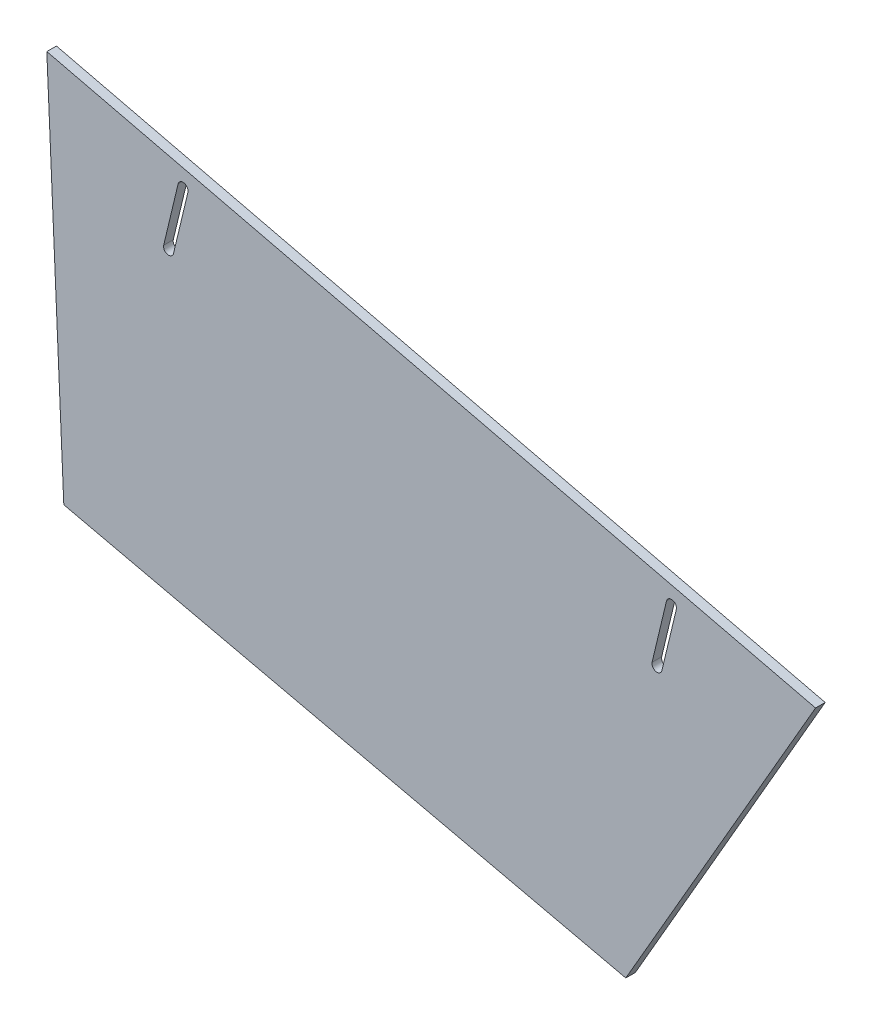
ISO-10303-21;
HEADER;
FILE_DESCRIPTION(('STEP AP214'),'2;1');
FILE_NAME('part.step','',(''),(''),'','','');
FILE_SCHEMA(('AUTOMOTIVE_DESIGN { 1 0 10303 214 1 1 1 1 }'));
ENDSEC;
DATA;
#1=APPLICATION_CONTEXT('core data for automotive mechanical design processes');
#2=APPLICATION_PROTOCOL_DEFINITION('international standard','automotive_design',2000,#1);
#3=PRODUCT_CONTEXT('',#1,'mechanical');
#4=PRODUCT('Part','Part','',(#3));
#5=PRODUCT_RELATED_PRODUCT_CATEGORY('part','',(#4));
#6=PRODUCT_DEFINITION_FORMATION('','',#4);
#7=PRODUCT_DEFINITION_CONTEXT('part definition',#1,'design');
#8=PRODUCT_DEFINITION('design','',#6,#7);
#9=PRODUCT_DEFINITION_SHAPE('','',#8);
#10=(LENGTH_UNIT() NAMED_UNIT(*) SI_UNIT(.MILLI.,.METRE.));
#11=(NAMED_UNIT(*) PLANE_ANGLE_UNIT() SI_UNIT($,.RADIAN.));
#12=(NAMED_UNIT(*) SI_UNIT($,.STERADIAN.) SOLID_ANGLE_UNIT());
#13=UNCERTAINTY_MEASURE_WITH_UNIT(LENGTH_MEASURE(1.E-05),#10,'distance_accuracy_value','');
#14=(GEOMETRIC_REPRESENTATION_CONTEXT(3) GLOBAL_UNCERTAINTY_ASSIGNED_CONTEXT((#13)) GLOBAL_UNIT_ASSIGNED_CONTEXT((#10,
#11,#12)) REPRESENTATION_CONTEXT('',''));
#15=CARTESIAN_POINT('',(0.,0.,0.));
#16=DIRECTION('',(0.,0.,1.));
#17=DIRECTION('',(1.,0.,0.));
#18=AXIS2_PLACEMENT_3D('',#15,#16,#17);
#19=CARTESIAN_POINT('',(0.,0.,4.));
#20=DIRECTION('',(0.,0.,-1.));
#21=DIRECTION('',(-1.,0.,0.));
#22=AXIS2_PLACEMENT_3D('',#19,#20,#21);
#23=PLANE('',#22);
#24=CARTESIAN_POINT('',(-190.314079857392,167.50887061503,4.));
#25=DIRECTION('',(0.,0.,1.));
#26=DIRECTION('',(1.,0.,0.));
#27=AXIS2_PLACEMENT_3D('',#24,#25,#26);
#28=CIRCLE('',#27,2.10000000000004);
#29=CARTESIAN_POINT('',(-192.35631309689,167.998036635406,4.));
#30=VERTEX_POINT('',#29);
#31=CARTESIAN_POINT('',(-188.271846617894,167.019704594653,4.));
#32=VERTEX_POINT('',#31);
#33=EDGE_CURVE('E164',#30,#32,#28,.T.);
#34=ORIENTED_EDGE('',*,*,#33,.F.);
#35=DIRECTION('',(-0.232936200179233,-0.972492018808412,0.));
#36=VECTOR('',#35,1.);
#37=CARTESIAN_POINT('',(-192.35631309689,167.998036635406,4.));
#38=LINE('',#37,#36);
#39=CARTESIAN_POINT('',(-186.346559132265,193.088330720663,4.));
#40=VERTEX_POINT('',#39);
#41=EDGE_CURVE('E172',#40,#30,#38,.T.);
#42=ORIENTED_EDGE('',*,*,#41,.F.);
#43=CARTESIAN_POINT('',(-184.304325892768,192.599164700287,4.));
#44=DIRECTION('',(0.,0.,1.));
#45=DIRECTION('',(1.,0.,0.));
#46=AXIS2_PLACEMENT_3D('',#43,#44,#45);
#47=CIRCLE('',#46,2.10000000000001);
#48=CARTESIAN_POINT('',(-182.26209265327,192.10999867991,4.));
#49=VERTEX_POINT('',#48);
#50=EDGE_CURVE('E169',#49,#40,#47,.T.);
#51=ORIENTED_EDGE('',*,*,#50,.F.);
#52=DIRECTION('',(0.232936200179231,0.972492018808412,0.));
#53=VECTOR('',#52,1.);
#54=CARTESIAN_POINT('',(-188.271846617894,167.019704594653,4.));
#55=LINE('',#54,#53);
#56=EDGE_CURVE('E166',#32,#49,#55,.T.);
#57=ORIENTED_EDGE('',*,*,#56,.F.);
#58=EDGE_LOOP('',(#34,#42,#51,#57));
#59=FACE_BOUND('',#58,.T.);
#60=DIRECTION('',(0.974707446562924,-0.223484660804238,0.));
#61=VECTOR('',#60,1.);
#62=CARTESIAN_POINT('',(-233.929787175102,53.636318593017,4.));
#63=LINE('',#62,#61);
#64=CARTESIAN_POINT('',(-233.929787175102,53.636318593017,4.));
#65=VERTEX_POINT('',#64);
#66=CARTESIAN_POINT('',(0.,0.,4.));
#67=VERTEX_POINT('',#66);
#68=EDGE_CURVE('E195',#65,#67,#63,.T.);
#69=ORIENTED_EDGE('',*,*,#68,.T.);
#70=DIRECTION('',(0.500000000000001,0.866025403784438,0.));
#71=VECTOR('',#70,1.);
#72=CARTESIAN_POINT('',(0.,0.,4.));
#73=LINE('',#72,#71);
#74=CARTESIAN_POINT('',(79.0000000000002,136.832013797941,4.));
#75=VERTEX_POINT('',#74);
#76=EDGE_CURVE('E198',#67,#75,#73,.T.);
#77=ORIENTED_EDGE('',*,*,#76,.T.);
#78=DIRECTION('',(-0.972492018808412,0.232936200179232,0.));
#79=VECTOR('',#78,1.);
#80=CARTESIAN_POINT('',(79.0000000000002,136.832013797941,4.));
#81=LINE('',#80,#79);
#82=CARTESIAN_POINT('',(-241.,213.48003004458,4.));
#83=VERTEX_POINT('',#82);
#84=EDGE_CURVE('E201',#75,#83,#81,.T.);
#85=ORIENTED_EDGE('',*,*,#84,.T.);
#86=DIRECTION('',(0.0441888301556132,-0.999023196572271,0.));
#87=VECTOR('',#86,1.);
#88=CARTESIAN_POINT('',(-241.,213.48003004458,4.));
#89=LINE('',#88,#87);
#90=EDGE_CURVE('E203',#83,#65,#89,.T.);
#91=ORIENTED_EDGE('',*,*,#90,.T.);
#92=EDGE_LOOP('',(#69,#77,#85,#91));
#93=FACE_BOUND('',#92,.T.);
#94=CARTESIAN_POINT('',(12.9868778855987,118.813198389898,4.));
#95=DIRECTION('',(0.,0.,1.));
#96=DIRECTION('',(-1.,0.,0.));
#97=AXIS2_PLACEMENT_3D('',#94,#95,#96);
#98=CIRCLE('',#97,2.10000000000004);
#99=CARTESIAN_POINT('',(10.944644646101,119.302364410275,4.));
#100=VERTEX_POINT('',#99);
#101=CARTESIAN_POINT('',(15.0291111250964,118.324032369522,4.));
#102=VERTEX_POINT('',#101);
#103=EDGE_CURVE('E128',#100,#102,#98,.T.);
#104=ORIENTED_EDGE('',*,*,#103,.F.);
#105=DIRECTION('',(-0.232936200179234,-0.972492018808412,0.));
#106=VECTOR('',#105,1.);
#107=CARTESIAN_POINT('',(10.944644646101,119.302364410275,4.));
#108=LINE('',#107,#106);
#109=CARTESIAN_POINT('',(16.9543986107252,144.392658495532,4.));
#110=VERTEX_POINT('',#109);
#111=EDGE_CURVE('E150',#110,#100,#108,.T.);
#112=ORIENTED_EDGE('',*,*,#111,.F.);
#113=CARTESIAN_POINT('',(18.9966318502229,143.903492475155,4.));
#114=DIRECTION('',(0.,0.,1.));
#115=DIRECTION('',(-1.,0.,0.));
#116=AXIS2_PLACEMENT_3D('',#113,#114,#115);
#117=CIRCLE('',#116,2.10000000000001);
#118=CARTESIAN_POINT('',(21.0388650897206,143.414326454779,4.));
#119=VERTEX_POINT('',#118);
#120=EDGE_CURVE('E148',#119,#110,#117,.T.);
#121=ORIENTED_EDGE('',*,*,#120,.F.);
#122=DIRECTION('',(0.232936200179232,0.972492018808412,0.));
#123=VECTOR('',#122,1.);
#124=CARTESIAN_POINT('',(15.0291111250964,118.324032369522,4.));
#125=LINE('',#124,#123);
#126=EDGE_CURVE('E136',#102,#119,#125,.T.);
#127=ORIENTED_EDGE('',*,*,#126,.F.);
#128=EDGE_LOOP('',(#104,#112,#121,#127));
#129=FACE_BOUND('',#128,.T.);
#130=ADVANCED_FACE('F39',(#59,#93,#129),#23,.F.);
#131=CARTESIAN_POINT('',(0.,0.,0.));
#132=DIRECTION('',(0.,0.,-1.));
#133=DIRECTION('',(-1.,0.,0.));
#134=AXIS2_PLACEMENT_3D('',#131,#132,#133);
#135=PLANE('',#134);
#136=DIRECTION('',(0.974707446562924,-0.223484660804238,0.));
#137=VECTOR('',#136,1.);
#138=CARTESIAN_POINT('',(-233.929787175102,53.636318593017,0.));
#139=LINE('',#138,#137);
#140=CARTESIAN_POINT('',(-233.929787175102,53.636318593017,0.));
#141=VERTEX_POINT('',#140);
#142=CARTESIAN_POINT('',(0.,0.,0.));
#143=VERTEX_POINT('',#142);
#144=EDGE_CURVE('E194',#141,#143,#139,.T.);
#145=ORIENTED_EDGE('',*,*,#144,.F.);
#146=DIRECTION('',(0.0441888301556132,-0.999023196572271,0.));
#147=VECTOR('',#146,1.);
#148=CARTESIAN_POINT('',(-241.,213.48003004458,0.));
#149=LINE('',#148,#147);
#150=CARTESIAN_POINT('',(-241.,213.48003004458,0.));
#151=VERTEX_POINT('',#150);
#152=EDGE_CURVE('E199',#151,#141,#149,.T.);
#153=ORIENTED_EDGE('',*,*,#152,.F.);
#154=DIRECTION('',(-0.972492018808412,0.232936200179232,0.));
#155=VECTOR('',#154,1.);
#156=CARTESIAN_POINT('',(79.0000000000002,136.832013797941,0.));
#157=LINE('',#156,#155);
#158=CARTESIAN_POINT('',(79.0000000000002,136.832013797941,0.));
#159=VERTEX_POINT('',#158);
#160=EDGE_CURVE('E210',#159,#151,#157,.T.);
#161=ORIENTED_EDGE('',*,*,#160,.F.);
#162=DIRECTION('',(0.500000000000001,0.866025403784438,0.));
#163=VECTOR('',#162,1.);
#164=CARTESIAN_POINT('',(0.,0.,0.));
#165=LINE('',#164,#163);
#166=EDGE_CURVE('E208',#143,#159,#165,.T.);
#167=ORIENTED_EDGE('',*,*,#166,.F.);
#168=EDGE_LOOP('',(#145,#153,#161,#167));
#169=FACE_BOUND('',#168,.T.);
#170=DIRECTION('',(-0.232936200179233,-0.972492018808412,0.));
#171=VECTOR('',#170,1.);
#172=CARTESIAN_POINT('',(-192.35631309689,167.998036635406,0.));
#173=LINE('',#172,#171);
#174=CARTESIAN_POINT('',(-186.346559132265,193.088330720663,0.));
#175=VERTEX_POINT('',#174);
#176=CARTESIAN_POINT('',(-192.356313096889,167.998036635406,0.));
#177=VERTEX_POINT('',#176);
#178=EDGE_CURVE('E167',#175,#177,#173,.T.);
#179=ORIENTED_EDGE('',*,*,#178,.T.);
#180=CARTESIAN_POINT('',(-190.314079857392,167.50887061503,0.));
#181=DIRECTION('',(0.,0.,1.));
#182=DIRECTION('',(1.,0.,0.));
#183=AXIS2_PLACEMENT_3D('',#180,#181,#182);
#184=CIRCLE('',#183,2.10000000000004);
#185=CARTESIAN_POINT('',(-188.271846617894,167.019704594653,0.));
#186=VERTEX_POINT('',#185);
#187=EDGE_CURVE('E144',#177,#186,#184,.T.);
#188=ORIENTED_EDGE('',*,*,#187,.T.);
#189=DIRECTION('',(0.232936200179231,0.972492018808412,0.));
#190=VECTOR('',#189,1.);
#191=CARTESIAN_POINT('',(-188.271846617894,167.019704594653,0.));
#192=LINE('',#191,#190);
#193=CARTESIAN_POINT('',(-182.26209265327,192.10999867991,0.));
#194=VERTEX_POINT('',#193);
#195=EDGE_CURVE('E177',#186,#194,#192,.T.);
#196=ORIENTED_EDGE('',*,*,#195,.T.);
#197=CARTESIAN_POINT('',(-184.304325892768,192.599164700287,0.));
#198=DIRECTION('',(0.,0.,1.));
#199=DIRECTION('',(1.,0.,0.));
#200=AXIS2_PLACEMENT_3D('',#197,#198,#199);
#201=CIRCLE('',#200,2.10000000000001);
#202=EDGE_CURVE('E180',#194,#175,#201,.T.);
#203=ORIENTED_EDGE('',*,*,#202,.T.);
#204=EDGE_LOOP('',(#179,#188,#196,#203));
#205=FACE_BOUND('',#204,.T.);
#206=DIRECTION('',(-0.232936200179234,-0.972492018808412,0.));
#207=VECTOR('',#206,1.);
#208=CARTESIAN_POINT('',(10.944644646101,119.302364410275,0.));
#209=LINE('',#208,#207);
#210=CARTESIAN_POINT('',(16.9543986107252,144.392658495532,0.));
#211=VERTEX_POINT('',#210);
#212=CARTESIAN_POINT('',(10.944644646101,119.302364410275,0.));
#213=VERTEX_POINT('',#212);
#214=EDGE_CURVE('E137',#211,#213,#209,.T.);
#215=ORIENTED_EDGE('',*,*,#214,.T.);
#216=CARTESIAN_POINT('',(12.9868778855987,118.813198389898,0.));
#217=DIRECTION('',(0.,0.,1.));
#218=DIRECTION('',(-1.,0.,0.));
#219=AXIS2_PLACEMENT_3D('',#216,#217,#218);
#220=CIRCLE('',#219,2.10000000000004);
#221=CARTESIAN_POINT('',(15.0291111250964,118.324032369522,0.));
#222=VERTEX_POINT('',#221);
#223=EDGE_CURVE('E62',#213,#222,#220,.T.);
#224=ORIENTED_EDGE('',*,*,#223,.T.);
#225=DIRECTION('',(0.232936200179232,0.972492018808412,0.));
#226=VECTOR('',#225,1.);
#227=CARTESIAN_POINT('',(15.0291111250964,118.324032369522,0.));
#228=LINE('',#227,#226);
#229=CARTESIAN_POINT('',(21.0388650897206,143.414326454779,0.));
#230=VERTEX_POINT('',#229);
#231=EDGE_CURVE('E143',#222,#230,#228,.T.);
#232=ORIENTED_EDGE('',*,*,#231,.T.);
#233=CARTESIAN_POINT('',(18.9966318502229,143.903492475155,0.));
#234=DIRECTION('',(0.,0.,1.));
#235=DIRECTION('',(-1.,0.,0.));
#236=AXIS2_PLACEMENT_3D('',#233,#234,#235);
#237=CIRCLE('',#236,2.10000000000001);
#238=EDGE_CURVE('E156',#230,#211,#237,.T.);
#239=ORIENTED_EDGE('',*,*,#238,.T.);
#240=EDGE_LOOP('',(#215,#224,#232,#239));
#241=FACE_BOUND('',#240,.T.);
#242=ADVANCED_FACE('F228',(#169,#205,#241),#135,.T.);
#243=CARTESIAN_POINT('',(-233.929787175102,53.636318593017,4.));
#244=DIRECTION('',(0.223484660804238,0.974707446562924,0.));
#245=DIRECTION('',(-0.974707446562924,0.223484660804238,0.));
#246=AXIS2_PLACEMENT_3D('',#243,#244,#245);
#247=PLANE('',#246);
#248=ORIENTED_EDGE('',*,*,#144,.T.);
#249=DIRECTION('',(0.,0.,-1.));
#250=VECTOR('',#249,1.);
#251=CARTESIAN_POINT('',(0.,0.,4.));
#252=LINE('',#251,#250);
#253=EDGE_CURVE('E11',#67,#143,#252,.T.);
#254=ORIENTED_EDGE('',*,*,#253,.F.);
#255=ORIENTED_EDGE('',*,*,#68,.F.);
#256=DIRECTION('',(0.,0.,-1.));
#257=VECTOR('',#256,1.);
#258=CARTESIAN_POINT('',(-233.929787175102,53.636318593017,4.));
#259=LINE('',#258,#257);
#260=EDGE_CURVE('E205',#65,#141,#259,.T.);
#261=ORIENTED_EDGE('',*,*,#260,.T.);
#262=EDGE_LOOP('',(#248,#254,#255,#261));
#263=FACE_BOUND('',#262,.T.);
#264=ADVANCED_FACE('F41',(#263),#247,.F.);
#265=CARTESIAN_POINT('',(0.,0.,4.));
#266=DIRECTION('',(-0.866025403784438,0.500000000000001,0.));
#267=DIRECTION('',(-0.500000000000001,-0.866025403784438,0.));
#268=AXIS2_PLACEMENT_3D('',#265,#266,#267);
#269=PLANE('',#268);
#270=ORIENTED_EDGE('',*,*,#166,.T.);
#271=DIRECTION('',(0.,0.,-1.));
#272=VECTOR('',#271,1.);
#273=CARTESIAN_POINT('',(79.0000000000002,136.832013797941,4.));
#274=LINE('',#273,#272);
#275=EDGE_CURVE('E47',#75,#159,#274,.T.);
#276=ORIENTED_EDGE('',*,*,#275,.F.);
#277=ORIENTED_EDGE('',*,*,#76,.F.);
#278=ORIENTED_EDGE('',*,*,#253,.T.);
#279=EDGE_LOOP('',(#270,#276,#277,#278));
#280=FACE_BOUND('',#279,.T.);
#281=ADVANCED_FACE('F238',(#280),#269,.F.);
#282=CARTESIAN_POINT('',(79.0000000000002,136.832013797941,4.));
#283=DIRECTION('',(-0.232936200179232,-0.972492018808412,0.));
#284=DIRECTION('',(0.972492018808412,-0.232936200179232,0.));
#285=AXIS2_PLACEMENT_3D('',#282,#283,#284);
#286=PLANE('',#285);
#287=ORIENTED_EDGE('',*,*,#160,.T.);
#288=DIRECTION('',(0.,0.,-1.));
#289=VECTOR('',#288,1.);
#290=CARTESIAN_POINT('',(-241.,213.48003004458,4.));
#291=LINE('',#290,#289);
#292=EDGE_CURVE('E215',#83,#151,#291,.T.);
#293=ORIENTED_EDGE('',*,*,#292,.F.);
#294=ORIENTED_EDGE('',*,*,#84,.F.);
#295=ORIENTED_EDGE('',*,*,#275,.T.);
#296=EDGE_LOOP('',(#287,#293,#294,#295));
#297=FACE_BOUND('',#296,.T.);
#298=ADVANCED_FACE('F222',(#297),#286,.F.);
#299=CARTESIAN_POINT('',(-241.,213.48003004458,4.));
#300=DIRECTION('',(0.999023196572271,0.0441888301556132,0.));
#301=DIRECTION('',(-0.0441888301556132,0.999023196572271,0.));
#302=AXIS2_PLACEMENT_3D('',#299,#300,#301);
#303=PLANE('',#302);
#304=ORIENTED_EDGE('',*,*,#152,.T.);
#305=ORIENTED_EDGE('',*,*,#260,.F.);
#306=ORIENTED_EDGE('',*,*,#90,.F.);
#307=ORIENTED_EDGE('',*,*,#292,.T.);
#308=EDGE_LOOP('',(#304,#305,#306,#307));
#309=FACE_BOUND('',#308,.T.);
#310=ADVANCED_FACE('F232',(#309),#303,.F.);
#311=CARTESIAN_POINT('',(-190.314079857392,167.50887061503,4.));
#312=DIRECTION('',(0.,0.,-1.));
#313=DIRECTION('',(-1.,0.,0.));
#314=AXIS2_PLACEMENT_3D('',#311,#312,#313);
#315=CYLINDRICAL_SURFACE('',#314,2.10000000000004);
#316=ORIENTED_EDGE('',*,*,#187,.F.);
#317=DIRECTION('',(0.,0.,-1.));
#318=VECTOR('',#317,1.);
#319=CARTESIAN_POINT('',(-192.35631309689,167.998036635406,4.));
#320=LINE('',#319,#318);
#321=EDGE_CURVE('E174',#30,#177,#320,.T.);
#322=ORIENTED_EDGE('',*,*,#321,.F.);
#323=ORIENTED_EDGE('',*,*,#33,.T.);
#324=DIRECTION('',(0.,0.,-1.));
#325=VECTOR('',#324,1.);
#326=CARTESIAN_POINT('',(-188.271846617894,167.019704594653,4.));
#327=LINE('',#326,#325);
#328=EDGE_CURVE('E191',#32,#186,#327,.T.);
#329=ORIENTED_EDGE('',*,*,#328,.T.);
#330=EDGE_LOOP('',(#316,#322,#323,#329));
#331=FACE_BOUND('',#330,.T.);
#332=ADVANCED_FACE('F254',(#331),#315,.F.);
#333=CARTESIAN_POINT('',(-188.271846617894,167.019704594653,4.));
#334=DIRECTION('',(-0.972492018808412,0.232936200179231,0.));
#335=DIRECTION('',(-0.232936200179231,-0.972492018808412,0.));
#336=AXIS2_PLACEMENT_3D('',#333,#334,#335);
#337=PLANE('',#336);
#338=ORIENTED_EDGE('',*,*,#195,.F.);
#339=ORIENTED_EDGE('',*,*,#328,.F.);
#340=ORIENTED_EDGE('',*,*,#56,.T.);
#341=DIRECTION('',(0.,0.,-1.));
#342=VECTOR('',#341,1.);
#343=CARTESIAN_POINT('',(-182.26209265327,192.10999867991,4.));
#344=LINE('',#343,#342);
#345=EDGE_CURVE('E189',#49,#194,#344,.T.);
#346=ORIENTED_EDGE('',*,*,#345,.T.);
#347=EDGE_LOOP('',(#338,#339,#340,#346));
#348=FACE_BOUND('',#347,.T.);
#349=ADVANCED_FACE('F261',(#348),#337,.T.);
#350=CARTESIAN_POINT('',(-184.304325892768,192.599164700287,4.));
#351=DIRECTION('',(0.,0.,-1.));
#352=DIRECTION('',(-1.,0.,0.));
#353=AXIS2_PLACEMENT_3D('',#350,#351,#352);
#354=CYLINDRICAL_SURFACE('',#353,2.10000000000001);
#355=ORIENTED_EDGE('',*,*,#202,.F.);
#356=ORIENTED_EDGE('',*,*,#345,.F.);
#357=ORIENTED_EDGE('',*,*,#50,.T.);
#358=DIRECTION('',(0.,0.,-1.));
#359=VECTOR('',#358,1.);
#360=CARTESIAN_POINT('',(-186.346559132265,193.088330720663,4.));
#361=LINE('',#360,#359);
#362=EDGE_CURVE('E187',#40,#175,#361,.T.);
#363=ORIENTED_EDGE('',*,*,#362,.T.);
#364=EDGE_LOOP('',(#355,#356,#357,#363));
#365=FACE_BOUND('',#364,.T.);
#366=ADVANCED_FACE('F266',(#365),#354,.F.);
#367=CARTESIAN_POINT('',(-192.35631309689,167.998036635406,4.));
#368=DIRECTION('',(0.972492018808412,-0.232936200179233,0.));
#369=DIRECTION('',(0.232936200179233,0.972492018808412,0.));
#370=AXIS2_PLACEMENT_3D('',#367,#368,#369);
#371=PLANE('',#370);
#372=ORIENTED_EDGE('',*,*,#178,.F.);
#373=ORIENTED_EDGE('',*,*,#362,.F.);
#374=ORIENTED_EDGE('',*,*,#41,.T.);
#375=ORIENTED_EDGE('',*,*,#321,.T.);
#376=EDGE_LOOP('',(#372,#373,#374,#375));
#377=FACE_BOUND('',#376,.T.);
#378=ADVANCED_FACE('F272',(#377),#371,.T.);
#379=CARTESIAN_POINT('',(12.9868778855987,118.813198389898,4.));
#380=DIRECTION('',(0.,0.,-1.));
#381=DIRECTION('',(-1.,0.,0.));
#382=AXIS2_PLACEMENT_3D('',#379,#380,#381);
#383=CYLINDRICAL_SURFACE('',#382,2.10000000000004);
#384=ORIENTED_EDGE('',*,*,#223,.F.);
#385=DIRECTION('',(0.,0.,-1.));
#386=VECTOR('',#385,1.);
#387=CARTESIAN_POINT('',(10.944644646101,119.302364410275,4.));
#388=LINE('',#387,#386);
#389=EDGE_CURVE('E132',#100,#213,#388,.T.);
#390=ORIENTED_EDGE('',*,*,#389,.F.);
#391=ORIENTED_EDGE('',*,*,#103,.T.);
#392=DIRECTION('',(0.,0.,-1.));
#393=VECTOR('',#392,1.);
#394=CARTESIAN_POINT('',(15.0291111250964,118.324032369522,4.));
#395=LINE('',#394,#393);
#396=EDGE_CURVE('E131',#102,#222,#395,.T.);
#397=ORIENTED_EDGE('',*,*,#396,.T.);
#398=EDGE_LOOP('',(#384,#390,#391,#397));
#399=FACE_BOUND('',#398,.T.);
#400=ADVANCED_FACE('F130',(#399),#383,.F.);
#401=CARTESIAN_POINT('',(15.0291111250964,118.324032369522,4.));
#402=DIRECTION('',(-0.972492018808412,0.232936200179232,0.));
#403=DIRECTION('',(-0.232936200179232,-0.972492018808412,0.));
#404=AXIS2_PLACEMENT_3D('',#401,#402,#403);
#405=PLANE('',#404);
#406=ORIENTED_EDGE('',*,*,#231,.F.);
#407=ORIENTED_EDGE('',*,*,#396,.F.);
#408=ORIENTED_EDGE('',*,*,#126,.T.);
#409=DIRECTION('',(0.,0.,-1.));
#410=VECTOR('',#409,1.);
#411=CARTESIAN_POINT('',(21.0388650897206,143.414326454779,4.));
#412=LINE('',#411,#410);
#413=EDGE_CURVE('E145',#119,#230,#412,.T.);
#414=ORIENTED_EDGE('',*,*,#413,.T.);
#415=EDGE_LOOP('',(#406,#407,#408,#414));
#416=FACE_BOUND('',#415,.T.);
#417=ADVANCED_FACE('F140',(#416),#405,.T.);
#418=CARTESIAN_POINT('',(18.9966318502229,143.903492475155,4.));
#419=DIRECTION('',(0.,0.,-1.));
#420=DIRECTION('',(-1.,0.,0.));
#421=AXIS2_PLACEMENT_3D('',#418,#419,#420);
#422=CYLINDRICAL_SURFACE('',#421,2.10000000000001);
#423=ORIENTED_EDGE('',*,*,#238,.F.);
#424=ORIENTED_EDGE('',*,*,#413,.F.);
#425=ORIENTED_EDGE('',*,*,#120,.T.);
#426=DIRECTION('',(0.,0.,-1.));
#427=VECTOR('',#426,1.);
#428=CARTESIAN_POINT('',(16.9543986107252,144.392658495532,4.));
#429=LINE('',#428,#427);
#430=EDGE_CURVE('E54',#110,#211,#429,.T.);
#431=ORIENTED_EDGE('',*,*,#430,.T.);
#432=EDGE_LOOP('',(#423,#424,#425,#431));
#433=FACE_BOUND('',#432,.T.);
#434=ADVANCED_FACE('F291',(#433),#422,.F.);
#435=CARTESIAN_POINT('',(10.944644646101,119.302364410275,4.));
#436=DIRECTION('',(0.972492018808412,-0.232936200179234,0.));
#437=DIRECTION('',(0.232936200179234,0.972492018808412,0.));
#438=AXIS2_PLACEMENT_3D('',#435,#436,#437);
#439=PLANE('',#438);
#440=ORIENTED_EDGE('',*,*,#214,.F.);
#441=ORIENTED_EDGE('',*,*,#430,.F.);
#442=ORIENTED_EDGE('',*,*,#111,.T.);
#443=ORIENTED_EDGE('',*,*,#389,.T.);
#444=EDGE_LOOP('',(#440,#441,#442,#443));
#445=FACE_BOUND('',#444,.T.);
#446=ADVANCED_FACE('F294',(#445),#439,.T.);
#447=CLOSED_SHELL('',(#130,#242,#264,#281,#298,#310,#332,#349,#366,#378,#400,#417,#434,#446));
#448=MANIFOLD_SOLID_BREP('B2',#447);
#449=ADVANCED_BREP_SHAPE_REPRESENTATION('',(#18,#448),#14);
#450=SHAPE_DEFINITION_REPRESENTATION(#9,#449);
ENDSEC;
END-ISO-10303-21;
